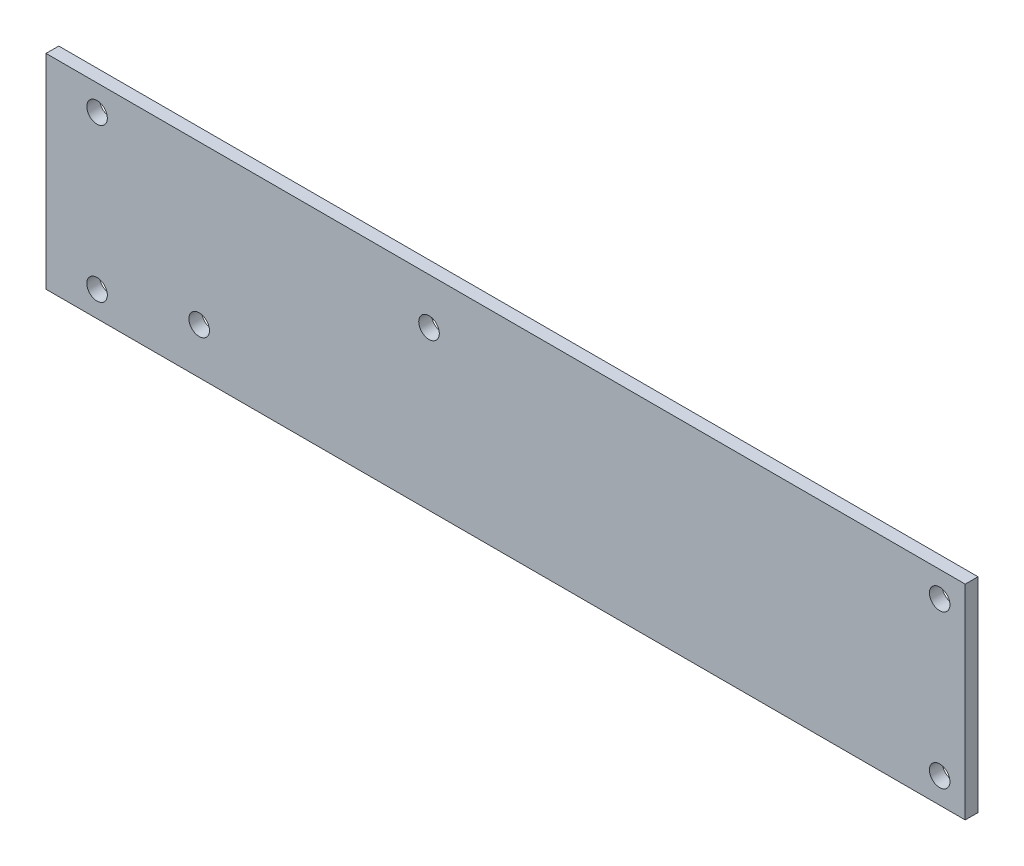
ISO-10303-21;
HEADER;
FILE_DESCRIPTION(('STEP AP214'),'2;1');
FILE_NAME('part.step','',(''),(''),'','','');
FILE_SCHEMA(('AUTOMOTIVE_DESIGN { 1 0 10303 214 1 1 1 1 }'));
ENDSEC;
DATA;
#1=APPLICATION_CONTEXT('core data for automotive mechanical design processes');
#2=APPLICATION_PROTOCOL_DEFINITION('international standard','automotive_design',2000,#1);
#3=PRODUCT_CONTEXT('',#1,'mechanical');
#4=PRODUCT('Part','Part','',(#3));
#5=PRODUCT_RELATED_PRODUCT_CATEGORY('part','',(#4));
#6=PRODUCT_DEFINITION_FORMATION('','',#4);
#7=PRODUCT_DEFINITION_CONTEXT('part definition',#1,'design');
#8=PRODUCT_DEFINITION('design','',#6,#7);
#9=PRODUCT_DEFINITION_SHAPE('','',#8);
#10=(LENGTH_UNIT() NAMED_UNIT(*) SI_UNIT(.MILLI.,.METRE.));
#11=(NAMED_UNIT(*) PLANE_ANGLE_UNIT() SI_UNIT($,.RADIAN.));
#12=(NAMED_UNIT(*) SI_UNIT($,.STERADIAN.) SOLID_ANGLE_UNIT());
#13=UNCERTAINTY_MEASURE_WITH_UNIT(LENGTH_MEASURE(1.E-05),#10,'distance_accuracy_value','');
#14=(GEOMETRIC_REPRESENTATION_CONTEXT(3) GLOBAL_UNCERTAINTY_ASSIGNED_CONTEXT((#13)) GLOBAL_UNIT_ASSIGNED_CONTEXT((#10,
#11,#12)) REPRESENTATION_CONTEXT('',''));
#15=CARTESIAN_POINT('',(0.,0.,0.));
#16=DIRECTION('',(0.,0.,1.));
#17=DIRECTION('',(1.,0.,0.));
#18=AXIS2_PLACEMENT_3D('',#15,#16,#17);
#19=CARTESIAN_POINT('',(-76.2,-13.97,-0.15875));
#20=DIRECTION('',(0.,0.,-1.));
#21=DIRECTION('',(1.,0.,0.));
#22=AXIS2_PLACEMENT_3D('',#19,#20,#21);
#23=CYLINDRICAL_SURFACE('',#22,2.55905);
#24=CARTESIAN_POINT('',(-76.2,-13.97,1.5875));
#25=DIRECTION('',(0.,0.,-1.));
#26=DIRECTION('',(1.,0.,0.));
#27=AXIS2_PLACEMENT_3D('',#24,#25,#26);
#28=CIRCLE('',#27,2.55905);
#29=CARTESIAN_POINT('',(-78.75905,-13.97,1.5875));
#30=VERTEX_POINT('',#29);
#31=EDGE_CURVE('E40',#30,#30,#28,.T.);
#32=ORIENTED_EDGE('',*,*,#31,.F.);
#33=DIRECTION('',(0.,0.,-1.));
#34=VECTOR('',#33,1.);
#35=CARTESIAN_POINT('',(-78.75905,-13.97,-0.15875));
#36=LINE('',#35,#34);
#37=CARTESIAN_POINT('',(-78.75905,-13.97,-1.5875));
#38=VERTEX_POINT('',#37);
#39=EDGE_CURVE('E11',#30,#38,#36,.T.);
#40=ORIENTED_EDGE('',*,*,#39,.T.);
#41=CARTESIAN_POINT('',(-76.2,-13.97,-1.5875));
#42=DIRECTION('',(0.,0.,1.));
#43=DIRECTION('',(1.,0.,0.));
#44=AXIS2_PLACEMENT_3D('',#41,#42,#43);
#45=CIRCLE('',#44,2.55905);
#46=EDGE_CURVE('E188',#38,#38,#45,.T.);
#47=ORIENTED_EDGE('',*,*,#46,.F.);
#48=ORIENTED_EDGE('',*,*,#39,.F.);
#49=EDGE_LOOP('',(#32,#40,#47,#48));
#50=FACE_BOUND('',#49,.T.);
#51=ADVANCED_FACE('F16',(#50),#23,.F.);
#52=CARTESIAN_POINT('',(-19.05,13.97,-0.15875));
#53=DIRECTION('',(0.,0.,-1.));
#54=DIRECTION('',(1.,0.,0.));
#55=AXIS2_PLACEMENT_3D('',#52,#53,#54);
#56=CYLINDRICAL_SURFACE('',#55,2.55905);
#57=CARTESIAN_POINT('',(-19.05,13.97,1.5875));
#58=DIRECTION('',(0.,0.,-1.));
#59=DIRECTION('',(1.,0.,0.));
#60=AXIS2_PLACEMENT_3D('',#57,#58,#59);
#61=CIRCLE('',#60,2.55905);
#62=CARTESIAN_POINT('',(-21.60905,13.97,1.5875));
#63=VERTEX_POINT('',#62);
#64=EDGE_CURVE('E229',#63,#63,#61,.T.);
#65=ORIENTED_EDGE('',*,*,#64,.F.);
#66=DIRECTION('',(0.,0.,-1.));
#67=VECTOR('',#66,1.);
#68=CARTESIAN_POINT('',(-21.60905,13.97,-0.15875));
#69=LINE('',#68,#67);
#70=CARTESIAN_POINT('',(-21.60905,13.97,-1.5875));
#71=VERTEX_POINT('',#70);
#72=EDGE_CURVE('E27',#63,#71,#69,.T.);
#73=ORIENTED_EDGE('',*,*,#72,.T.);
#74=CARTESIAN_POINT('',(-19.05,13.97,-1.5875));
#75=DIRECTION('',(0.,0.,1.));
#76=DIRECTION('',(1.,0.,0.));
#77=AXIS2_PLACEMENT_3D('',#74,#75,#76);
#78=CIRCLE('',#77,2.55905);
#79=EDGE_CURVE('E172',#71,#71,#78,.T.);
#80=ORIENTED_EDGE('',*,*,#79,.F.);
#81=ORIENTED_EDGE('',*,*,#72,.F.);
#82=EDGE_LOOP('',(#65,#73,#80,#81));
#83=FACE_BOUND('',#82,.T.);
#84=ADVANCED_FACE('F295',(#83),#56,.F.);
#85=CARTESIAN_POINT('',(107.95,19.05,-33.4125));
#86=DIRECTION('',(0.,0.,-1.));
#87=DIRECTION('',(1.,0.,0.));
#88=AXIS2_PLACEMENT_3D('',#85,#86,#87);
#89=CYLINDRICAL_SURFACE('',#88,2.5525);
#90=CARTESIAN_POINT('',(107.95,19.05,1.5875));
#91=DIRECTION('',(0.,0.,-1.));
#92=DIRECTION('',(1.,0.,0.));
#93=AXIS2_PLACEMENT_3D('',#90,#91,#92);
#94=CIRCLE('',#93,2.5525);
#95=CARTESIAN_POINT('',(110.5025,19.05,1.5875));
#96=VERTEX_POINT('',#95);
#97=CARTESIAN_POINT('',(105.3975,19.05,1.5875));
#98=VERTEX_POINT('',#97);
#99=EDGE_CURVE('E233',#96,#98,#94,.T.);
#100=ORIENTED_EDGE('',*,*,#99,.F.);
#101=CARTESIAN_POINT('',(107.95,19.05,1.5875));
#102=DIRECTION('',(0.,0.,-1.));
#103=DIRECTION('',(1.,0.,0.));
#104=AXIS2_PLACEMENT_3D('',#101,#102,#103);
#105=CIRCLE('',#104,2.5525);
#106=EDGE_CURVE('E147',#98,#96,#105,.T.);
#107=ORIENTED_EDGE('',*,*,#106,.F.);
#108=DIRECTION('',(0.,0.,-1.));
#109=VECTOR('',#108,1.);
#110=CARTESIAN_POINT('',(105.3975,19.05,-33.4125));
#111=LINE('',#110,#109);
#112=CARTESIAN_POINT('',(105.3975,19.05,-1.5875));
#113=VERTEX_POINT('',#112);
#114=EDGE_CURVE('E150',#98,#113,#111,.T.);
#115=ORIENTED_EDGE('',*,*,#114,.T.);
#116=CARTESIAN_POINT('',(107.95,19.05,-1.5875));
#117=DIRECTION('',(0.,0.,1.));
#118=DIRECTION('',(1.,0.,0.));
#119=AXIS2_PLACEMENT_3D('',#116,#117,#118);
#120=CIRCLE('',#119,2.5525);
#121=EDGE_CURVE('E168',#113,#113,#120,.T.);
#122=ORIENTED_EDGE('',*,*,#121,.F.);
#123=ORIENTED_EDGE('',*,*,#114,.F.);
#124=EDGE_LOOP('',(#100,#107,#115,#122,#123));
#125=FACE_BOUND('',#124,.T.);
#126=ADVANCED_FACE('F304',(#125),#89,.F.);
#127=CARTESIAN_POINT('',(-101.6,19.05,-33.4125));
#128=DIRECTION('',(0.,0.,-1.));
#129=DIRECTION('',(1.,0.,0.));
#130=AXIS2_PLACEMENT_3D('',#127,#128,#129);
#131=CYLINDRICAL_SURFACE('',#130,2.5525);
#132=CARTESIAN_POINT('',(-101.6,19.05,1.5875));
#133=DIRECTION('',(0.,0.,-1.));
#134=DIRECTION('',(1.,0.,0.));
#135=AXIS2_PLACEMENT_3D('',#132,#133,#134);
#136=CIRCLE('',#135,2.5525);
#137=CARTESIAN_POINT('',(-99.0475,19.05,1.5875));
#138=VERTEX_POINT('',#137);
#139=CARTESIAN_POINT('',(-104.1525,19.05,1.5875));
#140=VERTEX_POINT('',#139);
#141=EDGE_CURVE('E139',#138,#140,#136,.T.);
#142=ORIENTED_EDGE('',*,*,#141,.F.);
#143=CARTESIAN_POINT('',(-101.6,19.05,1.5875));
#144=DIRECTION('',(0.,0.,-1.));
#145=DIRECTION('',(1.,0.,0.));
#146=AXIS2_PLACEMENT_3D('',#143,#144,#145);
#147=CIRCLE('',#146,2.5525);
#148=EDGE_CURVE('E135',#140,#138,#147,.T.);
#149=ORIENTED_EDGE('',*,*,#148,.F.);
#150=DIRECTION('',(0.,0.,-1.));
#151=VECTOR('',#150,1.);
#152=CARTESIAN_POINT('',(-104.1525,19.05,-33.4125));
#153=LINE('',#152,#151);
#154=CARTESIAN_POINT('',(-104.1525,19.05,-1.5875));
#155=VERTEX_POINT('',#154);
#156=EDGE_CURVE('E138',#140,#155,#153,.T.);
#157=ORIENTED_EDGE('',*,*,#156,.T.);
#158=CARTESIAN_POINT('',(-101.6,19.05,-1.5875));
#159=DIRECTION('',(0.,0.,1.));
#160=DIRECTION('',(1.,0.,0.));
#161=AXIS2_PLACEMENT_3D('',#158,#159,#160);
#162=CIRCLE('',#161,2.5525);
#163=EDGE_CURVE('E130',#155,#155,#162,.T.);
#164=ORIENTED_EDGE('',*,*,#163,.F.);
#165=ORIENTED_EDGE('',*,*,#156,.F.);
#166=EDGE_LOOP('',(#142,#149,#157,#164,#165));
#167=FACE_BOUND('',#166,.T.);
#168=ADVANCED_FACE('F137',(#167),#131,.F.);
#169=CARTESIAN_POINT('',(-101.6,-19.05,-33.4125));
#170=DIRECTION('',(0.,0.,-1.));
#171=DIRECTION('',(1.,0.,0.));
#172=AXIS2_PLACEMENT_3D('',#169,#170,#171);
#173=CYLINDRICAL_SURFACE('',#172,2.5525);
#174=CARTESIAN_POINT('',(-101.6,-19.05,1.5875));
#175=DIRECTION('',(0.,0.,-1.));
#176=DIRECTION('',(1.,0.,0.));
#177=AXIS2_PLACEMENT_3D('',#174,#175,#176);
#178=CIRCLE('',#177,2.5525);
#179=CARTESIAN_POINT('',(-99.0475,-19.05,1.5875));
#180=VERTEX_POINT('',#179);
#181=CARTESIAN_POINT('',(-104.1525,-19.05,1.5875));
#182=VERTEX_POINT('',#181);
#183=EDGE_CURVE('E142',#180,#182,#178,.T.);
#184=ORIENTED_EDGE('',*,*,#183,.F.);
#185=CARTESIAN_POINT('',(-101.6,-19.05,1.5875));
#186=DIRECTION('',(0.,0.,-1.));
#187=DIRECTION('',(1.,0.,0.));
#188=AXIS2_PLACEMENT_3D('',#185,#186,#187);
#189=CIRCLE('',#188,2.5525);
#190=EDGE_CURVE('E178',#182,#180,#189,.T.);
#191=ORIENTED_EDGE('',*,*,#190,.F.);
#192=DIRECTION('',(0.,0.,-1.));
#193=VECTOR('',#192,1.);
#194=CARTESIAN_POINT('',(-104.1525,-19.05,-33.4125));
#195=LINE('',#194,#193);
#196=CARTESIAN_POINT('',(-104.1525,-19.05,-1.5875));
#197=VERTEX_POINT('',#196);
#198=EDGE_CURVE('E151',#182,#197,#195,.T.);
#199=ORIENTED_EDGE('',*,*,#198,.T.);
#200=CARTESIAN_POINT('',(-101.6,-19.05,-1.5875));
#201=DIRECTION('',(0.,0.,1.));
#202=DIRECTION('',(1.,0.,0.));
#203=AXIS2_PLACEMENT_3D('',#200,#201,#202);
#204=CIRCLE('',#203,2.5525);
#205=EDGE_CURVE('E196',#197,#197,#204,.T.);
#206=ORIENTED_EDGE('',*,*,#205,.F.);
#207=ORIENTED_EDGE('',*,*,#198,.F.);
#208=EDGE_LOOP('',(#184,#191,#199,#206,#207));
#209=FACE_BOUND('',#208,.T.);
#210=ADVANCED_FACE('F313',(#209),#173,.F.);
#211=CARTESIAN_POINT('',(107.95,-19.05,-33.4125));
#212=DIRECTION('',(0.,0.,-1.));
#213=DIRECTION('',(1.,0.,0.));
#214=AXIS2_PLACEMENT_3D('',#211,#212,#213);
#215=CYLINDRICAL_SURFACE('',#214,2.5525);
#216=CARTESIAN_POINT('',(107.95,-19.05,1.5875));
#217=DIRECTION('',(0.,0.,-1.));
#218=DIRECTION('',(1.,0.,0.));
#219=AXIS2_PLACEMENT_3D('',#216,#217,#218);
#220=CIRCLE('',#219,2.5525);
#221=CARTESIAN_POINT('',(110.5025,-19.05,1.5875));
#222=VERTEX_POINT('',#221);
#223=CARTESIAN_POINT('',(105.3975,-19.05,1.5875));
#224=VERTEX_POINT('',#223);
#225=EDGE_CURVE('E225',#222,#224,#220,.T.);
#226=ORIENTED_EDGE('',*,*,#225,.F.);
#227=CARTESIAN_POINT('',(107.95,-19.05,1.5875));
#228=DIRECTION('',(0.,0.,-1.));
#229=DIRECTION('',(1.,0.,0.));
#230=AXIS2_PLACEMENT_3D('',#227,#228,#229);
#231=CIRCLE('',#230,2.5525);
#232=EDGE_CURVE('E221',#224,#222,#231,.T.);
#233=ORIENTED_EDGE('',*,*,#232,.F.);
#234=DIRECTION('',(0.,0.,-1.));
#235=VECTOR('',#234,1.);
#236=CARTESIAN_POINT('',(105.3975,-19.05,-33.4125));
#237=LINE('',#236,#235);
#238=CARTESIAN_POINT('',(105.3975,-19.05,-1.5875));
#239=VERTEX_POINT('',#238);
#240=EDGE_CURVE('E160',#224,#239,#237,.T.);
#241=ORIENTED_EDGE('',*,*,#240,.T.);
#242=CARTESIAN_POINT('',(107.95,-19.05,-1.5875));
#243=DIRECTION('',(0.,0.,1.));
#244=DIRECTION('',(1.,0.,0.));
#245=AXIS2_PLACEMENT_3D('',#242,#243,#244);
#246=CIRCLE('',#245,2.5525);
#247=EDGE_CURVE('E200',#239,#239,#246,.T.);
#248=ORIENTED_EDGE('',*,*,#247,.F.);
#249=ORIENTED_EDGE('',*,*,#240,.F.);
#250=EDGE_LOOP('',(#226,#233,#241,#248,#249));
#251=FACE_BOUND('',#250,.T.);
#252=ADVANCED_FACE('F321',(#251),#215,.F.);
#253=CARTESIAN_POINT('',(-114.3,0.,0.));
#254=DIRECTION('',(-1.,0.,0.));
#255=DIRECTION('',(0.,0.,1.));
#256=AXIS2_PLACEMENT_3D('',#253,#254,#255);
#257=PLANE('',#256);
#258=DIRECTION('',(0.,-1.,0.));
#259=VECTOR('',#258,1.);
#260=CARTESIAN_POINT('',(-114.3,25.4,-1.5875));
#261=LINE('',#260,#259);
#262=CARTESIAN_POINT('',(-114.3,25.4,-1.5875));
#263=VERTEX_POINT('',#262);
#264=CARTESIAN_POINT('',(-114.3,-25.4,-1.5875));
#265=VERTEX_POINT('',#264);
#266=EDGE_CURVE('E195',#263,#265,#261,.T.);
#267=ORIENTED_EDGE('',*,*,#266,.T.);
#268=DIRECTION('',(0.,0.,1.));
#269=VECTOR('',#268,1.);
#270=CARTESIAN_POINT('',(-114.3,-25.4,-1.5875));
#271=LINE('',#270,#269);
#272=CARTESIAN_POINT('',(-114.3,-25.4,1.5875));
#273=VERTEX_POINT('',#272);
#274=EDGE_CURVE('E166',#265,#273,#271,.T.);
#275=ORIENTED_EDGE('',*,*,#274,.T.);
#276=DIRECTION('',(0.,1.,0.));
#277=VECTOR('',#276,1.);
#278=CARTESIAN_POINT('',(-114.3,-25.4,1.5875));
#279=LINE('',#278,#277);
#280=CARTESIAN_POINT('',(-114.3,25.4,1.5875));
#281=VERTEX_POINT('',#280);
#282=EDGE_CURVE('E163',#273,#281,#279,.T.);
#283=ORIENTED_EDGE('',*,*,#282,.T.);
#284=DIRECTION('',(0.,0.,-1.));
#285=VECTOR('',#284,1.);
#286=CARTESIAN_POINT('',(-114.3,25.4,1.5875));
#287=LINE('',#286,#285);
#288=EDGE_CURVE('E167',#281,#263,#287,.T.);
#289=ORIENTED_EDGE('',*,*,#288,.T.);
#290=EDGE_LOOP('',(#267,#275,#283,#289));
#291=FACE_BOUND('',#290,.T.);
#292=ADVANCED_FACE('F283',(#291),#257,.T.);
#293=CARTESIAN_POINT('',(0.,-25.4,1.5875));
#294=DIRECTION('',(0.,-1.,0.));
#295=DIRECTION('',(0.,0.,-1.));
#296=AXIS2_PLACEMENT_3D('',#293,#294,#295);
#297=PLANE('',#296);
#298=DIRECTION('',(-1.,0.,0.));
#299=VECTOR('',#298,1.);
#300=CARTESIAN_POINT('',(0.,-25.4,-1.5875));
#301=LINE('',#300,#299);
#302=CARTESIAN_POINT('',(114.3,-25.4,-1.5875));
#303=VERTEX_POINT('',#302);
#304=EDGE_CURVE('E234',#303,#265,#301,.T.);
#305=ORIENTED_EDGE('',*,*,#304,.F.);
#306=DIRECTION('',(0.,0.,-1.));
#307=VECTOR('',#306,1.);
#308=CARTESIAN_POINT('',(114.3,-25.4,-1.5875));
#309=LINE('',#308,#307);
#310=CARTESIAN_POINT('',(114.3,-25.4,1.5875));
#311=VERTEX_POINT('',#310);
#312=EDGE_CURVE('E184',#311,#303,#309,.T.);
#313=ORIENTED_EDGE('',*,*,#312,.F.);
#314=DIRECTION('',(1.,0.,0.));
#315=VECTOR('',#314,1.);
#316=CARTESIAN_POINT('',(0.,-25.4,1.5875));
#317=LINE('',#316,#315);
#318=EDGE_CURVE('E20',#273,#311,#317,.T.);
#319=ORIENTED_EDGE('',*,*,#318,.F.);
#320=ORIENTED_EDGE('',*,*,#274,.F.);
#321=EDGE_LOOP('',(#305,#313,#319,#320));
#322=FACE_BOUND('',#321,.T.);
#323=ADVANCED_FACE('F280',(#322),#297,.T.);
#324=CARTESIAN_POINT('',(0.,25.4,1.5875));
#325=DIRECTION('',(0.,0.,1.));
#326=DIRECTION('',(1.,0.,0.));
#327=AXIS2_PLACEMENT_3D('',#324,#325,#326);
#328=PLANE('',#327);
#329=ORIENTED_EDGE('',*,*,#318,.T.);
#330=DIRECTION('',(0.,-1.,0.));
#331=VECTOR('',#330,1.);
#332=CARTESIAN_POINT('',(114.3,-25.4,1.5875));
#333=LINE('',#332,#331);
#334=CARTESIAN_POINT('',(114.3,25.4,1.5875));
#335=VERTEX_POINT('',#334);
#336=EDGE_CURVE('E179',#335,#311,#333,.T.);
#337=ORIENTED_EDGE('',*,*,#336,.F.);
#338=DIRECTION('',(1.,0.,0.));
#339=VECTOR('',#338,1.);
#340=CARTESIAN_POINT('',(0.,25.4,1.5875));
#341=LINE('',#340,#339);
#342=EDGE_CURVE('E226',#281,#335,#341,.T.);
#343=ORIENTED_EDGE('',*,*,#342,.F.);
#344=ORIENTED_EDGE('',*,*,#282,.F.);
#345=EDGE_LOOP('',(#329,#337,#343,#344));
#346=FACE_BOUND('',#345,.T.);
#347=ORIENTED_EDGE('',*,*,#31,.T.);
#348=EDGE_LOOP('',(#347));
#349=FACE_BOUND('',#348,.T.);
#350=ORIENTED_EDGE('',*,*,#64,.T.);
#351=EDGE_LOOP('',(#350));
#352=FACE_BOUND('',#351,.T.);
#353=ORIENTED_EDGE('',*,*,#99,.T.);
#354=ORIENTED_EDGE('',*,*,#106,.T.);
#355=EDGE_LOOP('',(#353,#354));
#356=FACE_BOUND('',#355,.T.);
#357=ORIENTED_EDGE('',*,*,#141,.T.);
#358=ORIENTED_EDGE('',*,*,#148,.T.);
#359=EDGE_LOOP('',(#357,#358));
#360=FACE_BOUND('',#359,.T.);
#361=ORIENTED_EDGE('',*,*,#183,.T.);
#362=ORIENTED_EDGE('',*,*,#190,.T.);
#363=EDGE_LOOP('',(#361,#362));
#364=FACE_BOUND('',#363,.T.);
#365=ORIENTED_EDGE('',*,*,#225,.T.);
#366=ORIENTED_EDGE('',*,*,#232,.T.);
#367=EDGE_LOOP('',(#365,#366));
#368=FACE_BOUND('',#367,.T.);
#369=ADVANCED_FACE('F144',(#346,#349,#352,#356,#360,#364,#368),#328,.T.);
#370=CARTESIAN_POINT('',(0.,25.4,-1.5875));
#371=DIRECTION('',(0.,1.,0.));
#372=DIRECTION('',(1.,0.,0.));
#373=AXIS2_PLACEMENT_3D('',#370,#371,#372);
#374=PLANE('',#373);
#375=ORIENTED_EDGE('',*,*,#342,.T.);
#376=DIRECTION('',(0.,0.,1.));
#377=VECTOR('',#376,1.);
#378=CARTESIAN_POINT('',(114.3,25.4,1.5875));
#379=LINE('',#378,#377);
#380=CARTESIAN_POINT('',(114.3,25.4,-1.5875));
#381=VERTEX_POINT('',#380);
#382=EDGE_CURVE('E183',#381,#335,#379,.T.);
#383=ORIENTED_EDGE('',*,*,#382,.F.);
#384=DIRECTION('',(1.,0.,0.));
#385=VECTOR('',#384,1.);
#386=CARTESIAN_POINT('',(0.,25.4,-1.5875));
#387=LINE('',#386,#385);
#388=EDGE_CURVE('E237',#263,#381,#387,.T.);
#389=ORIENTED_EDGE('',*,*,#388,.F.);
#390=ORIENTED_EDGE('',*,*,#288,.F.);
#391=EDGE_LOOP('',(#375,#383,#389,#390));
#392=FACE_BOUND('',#391,.T.);
#393=ADVANCED_FACE('F270',(#392),#374,.T.);
#394=CARTESIAN_POINT('',(0.,-25.4,-1.5875));
#395=DIRECTION('',(0.,0.,-1.));
#396=DIRECTION('',(0.,-1.,0.));
#397=AXIS2_PLACEMENT_3D('',#394,#395,#396);
#398=PLANE('',#397);
#399=ORIENTED_EDGE('',*,*,#388,.T.);
#400=DIRECTION('',(0.,1.,0.));
#401=VECTOR('',#400,1.);
#402=CARTESIAN_POINT('',(114.3,25.4,-1.5875));
#403=LINE('',#402,#401);
#404=EDGE_CURVE('E220',#303,#381,#403,.T.);
#405=ORIENTED_EDGE('',*,*,#404,.F.);
#406=ORIENTED_EDGE('',*,*,#304,.T.);
#407=ORIENTED_EDGE('',*,*,#266,.F.);
#408=EDGE_LOOP('',(#399,#405,#406,#407));
#409=FACE_BOUND('',#408,.T.);
#410=ORIENTED_EDGE('',*,*,#46,.T.);
#411=EDGE_LOOP('',(#410));
#412=FACE_BOUND('',#411,.T.);
#413=ORIENTED_EDGE('',*,*,#79,.T.);
#414=EDGE_LOOP('',(#413));
#415=FACE_BOUND('',#414,.T.);
#416=ORIENTED_EDGE('',*,*,#121,.T.);
#417=EDGE_LOOP('',(#416));
#418=FACE_BOUND('',#417,.T.);
#419=ORIENTED_EDGE('',*,*,#163,.T.);
#420=EDGE_LOOP('',(#419));
#421=FACE_BOUND('',#420,.T.);
#422=ORIENTED_EDGE('',*,*,#205,.T.);
#423=EDGE_LOOP('',(#422));
#424=FACE_BOUND('',#423,.T.);
#425=ORIENTED_EDGE('',*,*,#247,.T.);
#426=EDGE_LOOP('',(#425));
#427=FACE_BOUND('',#426,.T.);
#428=ADVANCED_FACE('F277',(#409,#412,#415,#418,#421,#424,#427),#398,.T.);
#429=CARTESIAN_POINT('',(114.3,0.,0.));
#430=DIRECTION('',(1.,0.,0.));
#431=DIRECTION('',(0.,1.,0.));
#432=AXIS2_PLACEMENT_3D('',#429,#430,#431);
#433=PLANE('',#432);
#434=ORIENTED_EDGE('',*,*,#404,.T.);
#435=ORIENTED_EDGE('',*,*,#382,.T.);
#436=ORIENTED_EDGE('',*,*,#336,.T.);
#437=ORIENTED_EDGE('',*,*,#312,.T.);
#438=EDGE_LOOP('',(#434,#435,#436,#437));
#439=FACE_BOUND('',#438,.T.);
#440=ADVANCED_FACE('F18',(#439),#433,.T.);
#441=CLOSED_SHELL('',(#51,#84,#126,#168,#210,#252,#292,#323,#369,#393,#428,#440));
#442=MANIFOLD_SOLID_BREP('B1',#441);
#443=ADVANCED_BREP_SHAPE_REPRESENTATION('',(#18,#442),#14);
#444=SHAPE_DEFINITION_REPRESENTATION(#9,#443);
ENDSEC;
END-ISO-10303-21;
